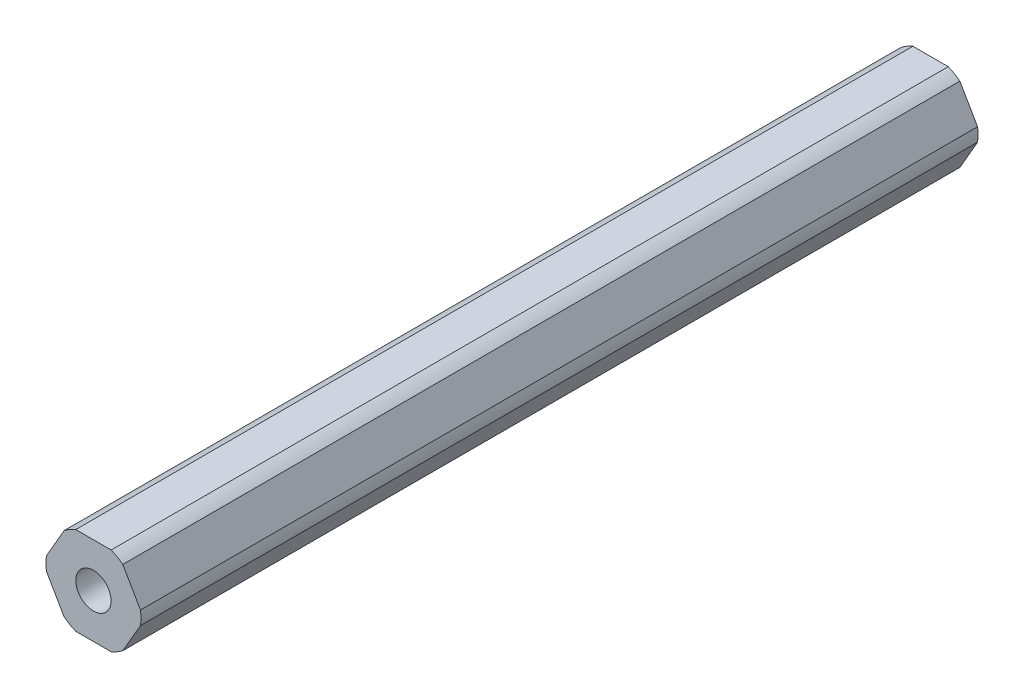
ISO-10303-21;
HEADER;
FILE_DESCRIPTION(('STEP AP214'),'2;1');
FILE_NAME('part.step','',(''),(''),'','','');
FILE_SCHEMA(('AUTOMOTIVE_DESIGN { 1 0 10303 214 1 1 1 1 }'));
ENDSEC;
DATA;
#1=APPLICATION_CONTEXT('core data for automotive mechanical design processes');
#2=APPLICATION_PROTOCOL_DEFINITION('international standard','automotive_design',2000,#1);
#3=PRODUCT_CONTEXT('',#1,'mechanical');
#4=PRODUCT('Part','Part','',(#3));
#5=PRODUCT_RELATED_PRODUCT_CATEGORY('part','',(#4));
#6=PRODUCT_DEFINITION_FORMATION('','',#4);
#7=PRODUCT_DEFINITION_CONTEXT('part definition',#1,'design');
#8=PRODUCT_DEFINITION('design','',#6,#7);
#9=PRODUCT_DEFINITION_SHAPE('','',#8);
#10=(LENGTH_UNIT() NAMED_UNIT(*) SI_UNIT(.MILLI.,.METRE.));
#11=(NAMED_UNIT(*) PLANE_ANGLE_UNIT() SI_UNIT($,.RADIAN.));
#12=(NAMED_UNIT(*) SI_UNIT($,.STERADIAN.) SOLID_ANGLE_UNIT());
#13=UNCERTAINTY_MEASURE_WITH_UNIT(LENGTH_MEASURE(1.E-05),#10,'distance_accuracy_value','');
#14=(GEOMETRIC_REPRESENTATION_CONTEXT(3) GLOBAL_UNCERTAINTY_ASSIGNED_CONTEXT((#13)) GLOBAL_UNIT_ASSIGNED_CONTEXT((#10,
#11,#12)) REPRESENTATION_CONTEXT('',''));
#15=CARTESIAN_POINT('',(0.,0.,0.));
#16=DIRECTION('',(0.,0.,1.));
#17=DIRECTION('',(1.,0.,0.));
#18=AXIS2_PLACEMENT_3D('',#15,#16,#17);
#19=CARTESIAN_POINT('',(0.,0.,-228.6));
#20=DIRECTION('',(0.,0.,1.));
#21=DIRECTION('',(1.,0.,0.));
#22=AXIS2_PLACEMENT_3D('',#19,#20,#21);
#23=CYLINDRICAL_SURFACE('',#22,6.87);
#24=DIRECTION('',(0.,0.,1.));
#25=VECTOR('',#24,1.);
#26=CARTESIAN_POINT('',(6.80102150534208,0.971085209378949,228.6));
#27=LINE('',#26,#25);
#28=CARTESIAN_POINT('',(6.80102150534208,0.97108520937895,107.52455));
#29=VERTEX_POINT('',#28);
#30=CARTESIAN_POINT('',(6.80102150534208,0.971085209378947,228.6));
#31=VERTEX_POINT('',#30);
#32=EDGE_CURVE('E109',#29,#31,#27,.T.);
#33=ORIENTED_EDGE('',*,*,#32,.T.);
#34=CARTESIAN_POINT('',(0.,0.,228.6));
#35=DIRECTION('',(0.,0.,1.));
#36=DIRECTION('',(1.,0.,0.));
#37=AXIS2_PLACEMENT_3D('',#34,#35,#36);
#38=CIRCLE('',#37,6.87);
#39=CARTESIAN_POINT('',(6.80102150534208,-0.971085209378953,228.6));
#40=VERTEX_POINT('',#39);
#41=EDGE_CURVE('E104',#31,#40,#38,.F.);
#42=ORIENTED_EDGE('',*,*,#41,.T.);
#43=DIRECTION('',(0.,0.,1.));
#44=VECTOR('',#43,1.);
#45=CARTESIAN_POINT('',(6.80102150534208,-0.971085209378954,228.6));
#46=LINE('',#45,#44);
#47=CARTESIAN_POINT('',(6.80102150534208,-0.971085209378956,107.52455));
#48=VERTEX_POINT('',#47);
#49=EDGE_CURVE('E106',#40,#48,#46,.F.);
#50=ORIENTED_EDGE('',*,*,#49,.T.);
#51=CARTESIAN_POINT('',(0.,0.,107.52455));
#52=DIRECTION('',(0.,0.,1.));
#53=DIRECTION('',(1.,0.,0.));
#54=AXIS2_PLACEMENT_3D('',#51,#52,#53);
#55=CIRCLE('',#54,6.87);
#56=EDGE_CURVE('E20',#48,#29,#55,.T.);
#57=ORIENTED_EDGE('',*,*,#56,.T.);
#58=EDGE_LOOP('',(#33,#42,#50,#57));
#59=FACE_BOUND('',#58,.T.);
#60=ADVANCED_FACE('F17',(#59),#23,.T.);
#61=CARTESIAN_POINT('',(-3.68083890619154,6.3754,228.6));
#62=DIRECTION('',(0.866025403784439,-0.5,0.));
#63=DIRECTION('',(0.5,0.866025403784439,0.));
#64=AXIS2_PLACEMENT_3D('',#61,#62,#63);
#65=PLANE('',#64);
#66=DIRECTION('',(-0.5,-0.866025403784439,0.));
#67=VECTOR('',#66,1.);
#68=CARTESIAN_POINT('',(-4.24149521323255,5.40431479062104,107.52455));
#69=LINE('',#68,#67);
#70=CARTESIAN_POINT('',(-4.24149521323255,5.40431479062105,107.52455));
#71=VERTEX_POINT('',#70);
#72=CARTESIAN_POINT('',(-6.80102150534208,0.971085209378961,107.52455));
#73=VERTEX_POINT('',#72);
#74=EDGE_CURVE('E173',#71,#73,#69,.T.);
#75=ORIENTED_EDGE('',*,*,#74,.T.);
#76=DIRECTION('',(0.,0.,1.));
#77=VECTOR('',#76,1.);
#78=CARTESIAN_POINT('',(-6.80102150534208,0.971085209378962,-228.6));
#79=LINE('',#78,#77);
#80=CARTESIAN_POINT('',(-6.80102150534208,0.971085209378964,228.6));
#81=VERTEX_POINT('',#80);
#82=EDGE_CURVE('E113',#81,#73,#79,.F.);
#83=ORIENTED_EDGE('',*,*,#82,.F.);
#84=DIRECTION('',(-0.5,-0.866025403784439,0.));
#85=VECTOR('',#84,1.);
#86=CARTESIAN_POINT('',(-4.24149521323255,5.40431479062105,228.6));
#87=LINE('',#86,#85);
#88=CARTESIAN_POINT('',(-4.24149521323255,5.40431479062104,228.6));
#89=VERTEX_POINT('',#88);
#90=EDGE_CURVE('E181',#89,#81,#87,.T.);
#91=ORIENTED_EDGE('',*,*,#90,.F.);
#92=DIRECTION('',(0.,0.,1.));
#93=VECTOR('',#92,1.);
#94=CARTESIAN_POINT('',(-4.24149521323255,5.40431479062104,-228.6));
#95=LINE('',#94,#93);
#96=EDGE_CURVE('E131',#71,#89,#95,.T.);
#97=ORIENTED_EDGE('',*,*,#96,.F.);
#98=EDGE_LOOP('',(#75,#83,#91,#97));
#99=FACE_BOUND('',#98,.T.);
#100=ADVANCED_FACE('F239',(#99),#65,.F.);
#101=CARTESIAN_POINT('',(0.,0.,-228.6));
#102=DIRECTION('',(0.,0.,1.));
#103=DIRECTION('',(1.,0.,0.));
#104=AXIS2_PLACEMENT_3D('',#101,#102,#103);
#105=CYLINDRICAL_SURFACE('',#104,6.87);
#106=CARTESIAN_POINT('',(0.,0.,228.6));
#107=DIRECTION('',(0.,0.,1.));
#108=DIRECTION('',(1.,0.,0.));
#109=AXIS2_PLACEMENT_3D('',#106,#107,#108);
#110=CIRCLE('',#109,6.87);
#111=CARTESIAN_POINT('',(-6.80102150534208,-0.971085209378954,228.6));
#112=VERTEX_POINT('',#111);
#113=EDGE_CURVE('E179',#81,#112,#110,.T.);
#114=ORIENTED_EDGE('',*,*,#113,.F.);
#115=ORIENTED_EDGE('',*,*,#82,.T.);
#116=CARTESIAN_POINT('',(0.,0.,107.52455));
#117=DIRECTION('',(0.,0.,1.));
#118=DIRECTION('',(1.,0.,0.));
#119=AXIS2_PLACEMENT_3D('',#116,#117,#118);
#120=CIRCLE('',#119,6.87);
#121=CARTESIAN_POINT('',(-6.80102150534208,-0.971085209378953,107.52455));
#122=VERTEX_POINT('',#121);
#123=EDGE_CURVE('E170',#73,#122,#120,.T.);
#124=ORIENTED_EDGE('',*,*,#123,.T.);
#125=DIRECTION('',(0.,0.,1.));
#126=VECTOR('',#125,1.);
#127=CARTESIAN_POINT('',(-6.80102150534208,-0.971085209378955,228.6));
#128=LINE('',#127,#126);
#129=EDGE_CURVE('E149',#122,#112,#128,.T.);
#130=ORIENTED_EDGE('',*,*,#129,.T.);
#131=EDGE_LOOP('',(#114,#115,#124,#130));
#132=FACE_BOUND('',#131,.T.);
#133=ADVANCED_FACE('F235',(#132),#105,.T.);
#134=CARTESIAN_POINT('',(-7.36167781238308,0.,228.6));
#135=DIRECTION('',(0.866025403784439,0.5,0.));
#136=DIRECTION('',(-0.5,0.866025403784439,0.));
#137=AXIS2_PLACEMENT_3D('',#134,#135,#136);
#138=PLANE('',#137);
#139=DIRECTION('',(0.5,-0.866025403784439,0.));
#140=VECTOR('',#139,1.);
#141=CARTESIAN_POINT('',(-6.80102150534208,-0.971085209378955,107.52455));
#142=LINE('',#141,#140);
#143=CARTESIAN_POINT('',(-4.24149521323255,-5.40431479062105,107.52455));
#144=VERTEX_POINT('',#143);
#145=EDGE_CURVE('E169',#122,#144,#142,.T.);
#146=ORIENTED_EDGE('',*,*,#145,.T.);
#147=DIRECTION('',(0.,0.,1.));
#148=VECTOR('',#147,1.);
#149=CARTESIAN_POINT('',(-4.24149521323255,-5.40431479062105,-228.6));
#150=LINE('',#149,#148);
#151=CARTESIAN_POINT('',(-4.24149521323255,-5.40431479062105,228.6));
#152=VERTEX_POINT('',#151);
#153=EDGE_CURVE('E147',#152,#144,#150,.F.);
#154=ORIENTED_EDGE('',*,*,#153,.F.);
#155=DIRECTION('',(0.5,-0.866025403784439,0.));
#156=VECTOR('',#155,1.);
#157=CARTESIAN_POINT('',(-6.80102150534208,-0.971085209378955,228.6));
#158=LINE('',#157,#156);
#159=EDGE_CURVE('E178',#112,#152,#158,.T.);
#160=ORIENTED_EDGE('',*,*,#159,.F.);
#161=ORIENTED_EDGE('',*,*,#129,.F.);
#162=EDGE_LOOP('',(#146,#154,#160,#161));
#163=FACE_BOUND('',#162,.T.);
#164=ADVANCED_FACE('F231',(#163),#138,.F.);
#165=CARTESIAN_POINT('',(0.,0.,-228.6));
#166=DIRECTION('',(0.,0.,1.));
#167=DIRECTION('',(1.,0.,0.));
#168=AXIS2_PLACEMENT_3D('',#165,#166,#167);
#169=CYLINDRICAL_SURFACE('',#168,6.87);
#170=CARTESIAN_POINT('',(0.,0.,228.6));
#171=DIRECTION('',(0.,0.,1.));
#172=DIRECTION('',(1.,0.,0.));
#173=AXIS2_PLACEMENT_3D('',#170,#171,#172);
#174=CIRCLE('',#173,6.87);
#175=CARTESIAN_POINT('',(-2.55952629210953,-6.3754,228.6));
#176=VERTEX_POINT('',#175);
#177=EDGE_CURVE('E176',#152,#176,#174,.T.);
#178=ORIENTED_EDGE('',*,*,#177,.F.);
#179=ORIENTED_EDGE('',*,*,#153,.T.);
#180=CARTESIAN_POINT('',(0.,0.,107.52455));
#181=DIRECTION('',(0.,0.,1.));
#182=DIRECTION('',(1.,0.,0.));
#183=AXIS2_PLACEMENT_3D('',#180,#181,#182);
#184=CIRCLE('',#183,6.87);
#185=CARTESIAN_POINT('',(-2.55952629210953,-6.3754,107.52455));
#186=VERTEX_POINT('',#185);
#187=EDGE_CURVE('E166',#144,#186,#184,.T.);
#188=ORIENTED_EDGE('',*,*,#187,.T.);
#189=DIRECTION('',(0.,0.,1.));
#190=VECTOR('',#189,1.);
#191=CARTESIAN_POINT('',(-2.55952629210953,-6.3754,228.6));
#192=LINE('',#191,#190);
#193=EDGE_CURVE('E144',#186,#176,#192,.T.);
#194=ORIENTED_EDGE('',*,*,#193,.T.);
#195=EDGE_LOOP('',(#178,#179,#188,#194));
#196=FACE_BOUND('',#195,.T.);
#197=ADVANCED_FACE('F227',(#196),#169,.T.);
#198=CARTESIAN_POINT('',(-3.68083890619154,-6.3754,228.6));
#199=DIRECTION('',(0.,1.,0.));
#200=DIRECTION('',(0.,0.,1.));
#201=AXIS2_PLACEMENT_3D('',#198,#199,#200);
#202=PLANE('',#201);
#203=DIRECTION('',(1.,0.,0.));
#204=VECTOR('',#203,1.);
#205=CARTESIAN_POINT('',(-17.1397032421943,-6.37540000000001,107.52455));
#206=LINE('',#205,#204);
#207=CARTESIAN_POINT('',(2.55952629210953,-6.37540000000001,107.52455));
#208=VERTEX_POINT('',#207);
#209=EDGE_CURVE('E165',#186,#208,#206,.T.);
#210=ORIENTED_EDGE('',*,*,#209,.T.);
#211=DIRECTION('',(0.,0.,1.));
#212=VECTOR('',#211,1.);
#213=CARTESIAN_POINT('',(2.55952629210953,-6.3754,-228.6));
#214=LINE('',#213,#212);
#215=CARTESIAN_POINT('',(2.55952629210953,-6.3754,228.6));
#216=VERTEX_POINT('',#215);
#217=EDGE_CURVE('E121',#216,#208,#214,.F.);
#218=ORIENTED_EDGE('',*,*,#217,.F.);
#219=DIRECTION('',(1.,0.,0.));
#220=VECTOR('',#219,1.);
#221=CARTESIAN_POINT('',(0.,-6.3754,228.6));
#222=LINE('',#221,#220);
#223=EDGE_CURVE('E175',#176,#216,#222,.T.);
#224=ORIENTED_EDGE('',*,*,#223,.F.);
#225=ORIENTED_EDGE('',*,*,#193,.F.);
#226=EDGE_LOOP('',(#210,#218,#224,#225));
#227=FACE_BOUND('',#226,.T.);
#228=ADVANCED_FACE('F222',(#227),#202,.F.);
#229=CARTESIAN_POINT('',(0.,0.,-228.6));
#230=DIRECTION('',(0.,0.,1.));
#231=DIRECTION('',(1.,0.,0.));
#232=AXIS2_PLACEMENT_3D('',#229,#230,#231);
#233=CYLINDRICAL_SURFACE('',#232,6.87);
#234=CARTESIAN_POINT('',(0.,0.,228.6));
#235=DIRECTION('',(0.,0.,1.));
#236=DIRECTION('',(1.,0.,0.));
#237=AXIS2_PLACEMENT_3D('',#234,#235,#236);
#238=CIRCLE('',#237,6.87);
#239=CARTESIAN_POINT('',(4.24149521323254,-5.40431479062105,228.6));
#240=VERTEX_POINT('',#239);
#241=EDGE_CURVE('E126',#216,#240,#238,.T.);
#242=ORIENTED_EDGE('',*,*,#241,.F.);
#243=ORIENTED_EDGE('',*,*,#217,.T.);
#244=CARTESIAN_POINT('',(0.,0.,107.52455));
#245=DIRECTION('',(0.,0.,1.));
#246=DIRECTION('',(1.,0.,0.));
#247=AXIS2_PLACEMENT_3D('',#244,#245,#246);
#248=CIRCLE('',#247,6.87);
#249=CARTESIAN_POINT('',(4.24149521323254,-5.40431479062105,107.52455));
#250=VERTEX_POINT('',#249);
#251=EDGE_CURVE('E162',#208,#250,#248,.T.);
#252=ORIENTED_EDGE('',*,*,#251,.T.);
#253=DIRECTION('',(0.,0.,1.));
#254=VECTOR('',#253,1.);
#255=CARTESIAN_POINT('',(4.24149521323254,-5.40431479062105,228.6));
#256=LINE('',#255,#254);
#257=EDGE_CURVE('E120',#250,#240,#256,.T.);
#258=ORIENTED_EDGE('',*,*,#257,.T.);
#259=EDGE_LOOP('',(#242,#243,#252,#258));
#260=FACE_BOUND('',#259,.T.);
#261=ADVANCED_FACE('F218',(#260),#233,.T.);
#262=CARTESIAN_POINT('',(3.68083890619154,-6.3754,228.6));
#263=DIRECTION('',(-0.866025403784439,0.5,0.));
#264=DIRECTION('',(-0.5,-0.866025403784439,0.));
#265=AXIS2_PLACEMENT_3D('',#262,#263,#264);
#266=PLANE('',#265);
#267=DIRECTION('',(0.5,0.866025403784439,0.));
#268=VECTOR('',#267,1.);
#269=CARTESIAN_POINT('',(4.24149521323254,-5.40431479062105,107.52455));
#270=LINE('',#269,#268);
#271=EDGE_CURVE('E119',#250,#48,#270,.T.);
#272=ORIENTED_EDGE('',*,*,#271,.T.);
#273=ORIENTED_EDGE('',*,*,#49,.F.);
#274=DIRECTION('',(0.5,0.866025403784439,0.));
#275=VECTOR('',#274,1.);
#276=CARTESIAN_POINT('',(4.24149521323254,-5.40431479062105,228.6));
#277=LINE('',#276,#275);
#278=EDGE_CURVE('E117',#240,#40,#277,.T.);
#279=ORIENTED_EDGE('',*,*,#278,.F.);
#280=ORIENTED_EDGE('',*,*,#257,.F.);
#281=EDGE_LOOP('',(#272,#273,#279,#280));
#282=FACE_BOUND('',#281,.T.);
#283=ADVANCED_FACE('F116',(#282),#266,.F.);
#284=CARTESIAN_POINT('',(7.36167781238308,0.,228.6));
#285=DIRECTION('',(-0.866025403784439,-0.5,0.));
#286=DIRECTION('',(0.5,-0.866025403784439,0.));
#287=AXIS2_PLACEMENT_3D('',#284,#285,#286);
#288=PLANE('',#287);
#289=DIRECTION('',(-0.5,0.866025403784438,0.));
#290=VECTOR('',#289,1.);
#291=CARTESIAN_POINT('',(6.80102150534208,0.971085209378948,107.52455));
#292=LINE('',#291,#290);
#293=CARTESIAN_POINT('',(4.24149521323254,5.40431479062105,107.52455));
#294=VERTEX_POINT('',#293);
#295=EDGE_CURVE('E161',#29,#294,#292,.T.);
#296=ORIENTED_EDGE('',*,*,#295,.T.);
#297=DIRECTION('',(0.,0.,1.));
#298=VECTOR('',#297,1.);
#299=CARTESIAN_POINT('',(4.24149521323254,5.40431479062105,-228.6));
#300=LINE('',#299,#298);
#301=CARTESIAN_POINT('',(4.24149521323254,5.40431479062105,228.6));
#302=VERTEX_POINT('',#301);
#303=EDGE_CURVE('E139',#302,#294,#300,.F.);
#304=ORIENTED_EDGE('',*,*,#303,.F.);
#305=DIRECTION('',(-0.5,0.866025403784439,0.));
#306=VECTOR('',#305,1.);
#307=CARTESIAN_POINT('',(6.80102150534208,0.971085209378948,228.6));
#308=LINE('',#307,#306);
#309=EDGE_CURVE('E127',#31,#302,#308,.T.);
#310=ORIENTED_EDGE('',*,*,#309,.F.);
#311=ORIENTED_EDGE('',*,*,#32,.F.);
#312=EDGE_LOOP('',(#296,#304,#310,#311));
#313=FACE_BOUND('',#312,.T.);
#314=ADVANCED_FACE('F213',(#313),#288,.F.);
#315=CARTESIAN_POINT('',(0.,0.,-228.6));
#316=DIRECTION('',(0.,0.,1.));
#317=DIRECTION('',(1.,0.,0.));
#318=AXIS2_PLACEMENT_3D('',#315,#316,#317);
#319=CYLINDRICAL_SURFACE('',#318,6.87);
#320=CARTESIAN_POINT('',(0.,0.,228.6));
#321=DIRECTION('',(0.,0.,1.));
#322=DIRECTION('',(1.,0.,0.));
#323=AXIS2_PLACEMENT_3D('',#320,#321,#322);
#324=CIRCLE('',#323,6.87);
#325=CARTESIAN_POINT('',(2.55952629210953,6.37540000000001,228.6));
#326=VERTEX_POINT('',#325);
#327=EDGE_CURVE('E129',#302,#326,#324,.T.);
#328=ORIENTED_EDGE('',*,*,#327,.F.);
#329=ORIENTED_EDGE('',*,*,#303,.T.);
#330=CARTESIAN_POINT('',(0.,0.,107.52455));
#331=DIRECTION('',(0.,0.,1.));
#332=DIRECTION('',(1.,0.,0.));
#333=AXIS2_PLACEMENT_3D('',#330,#331,#332);
#334=CIRCLE('',#333,6.87);
#335=CARTESIAN_POINT('',(2.55952629210953,6.37540000000001,107.52455));
#336=VERTEX_POINT('',#335);
#337=EDGE_CURVE('E158',#294,#336,#334,.T.);
#338=ORIENTED_EDGE('',*,*,#337,.T.);
#339=DIRECTION('',(0.,0.,1.));
#340=VECTOR('',#339,1.);
#341=CARTESIAN_POINT('',(2.55952629210953,6.3754,228.6));
#342=LINE('',#341,#340);
#343=EDGE_CURVE('E136',#336,#326,#342,.T.);
#344=ORIENTED_EDGE('',*,*,#343,.T.);
#345=EDGE_LOOP('',(#328,#329,#338,#344));
#346=FACE_BOUND('',#345,.T.);
#347=ADVANCED_FACE('F210',(#346),#319,.T.);
#348=CARTESIAN_POINT('',(3.68083890619154,6.3754,228.6));
#349=DIRECTION('',(0.,-1.,0.));
#350=DIRECTION('',(1.,0.,0.));
#351=AXIS2_PLACEMENT_3D('',#348,#349,#350);
#352=PLANE('',#351);
#353=DIRECTION('',(1.,0.,0.));
#354=VECTOR('',#353,1.);
#355=CARTESIAN_POINT('',(-17.1397032421943,6.37540000000001,107.52455));
#356=LINE('',#355,#354);
#357=CARTESIAN_POINT('',(-2.55952629210953,6.37540000000001,107.52455));
#358=VERTEX_POINT('',#357);
#359=EDGE_CURVE('E157',#336,#358,#356,.F.);
#360=ORIENTED_EDGE('',*,*,#359,.T.);
#361=DIRECTION('',(0.,0.,1.));
#362=VECTOR('',#361,1.);
#363=CARTESIAN_POINT('',(-2.55952629210953,6.37540000000001,-228.6));
#364=LINE('',#363,#362);
#365=CARTESIAN_POINT('',(-2.55952629210953,6.37540000000001,228.6));
#366=VERTEX_POINT('',#365);
#367=EDGE_CURVE('E35',#366,#358,#364,.F.);
#368=ORIENTED_EDGE('',*,*,#367,.F.);
#369=DIRECTION('',(1.,0.,0.));
#370=VECTOR('',#369,1.);
#371=CARTESIAN_POINT('',(0.,6.37540000000001,228.6));
#372=LINE('',#371,#370);
#373=EDGE_CURVE('E185',#326,#366,#372,.F.);
#374=ORIENTED_EDGE('',*,*,#373,.F.);
#375=ORIENTED_EDGE('',*,*,#343,.F.);
#376=EDGE_LOOP('',(#360,#368,#374,#375));
#377=FACE_BOUND('',#376,.T.);
#378=ADVANCED_FACE('F204',(#377),#352,.F.);
#379=CARTESIAN_POINT('',(0.,0.,-228.6));
#380=DIRECTION('',(0.,0.,1.));
#381=DIRECTION('',(1.,0.,0.));
#382=AXIS2_PLACEMENT_3D('',#379,#380,#381);
#383=CYLINDRICAL_SURFACE('',#382,6.87);
#384=CARTESIAN_POINT('',(0.,0.,228.6));
#385=DIRECTION('',(0.,0.,1.));
#386=DIRECTION('',(1.,0.,0.));
#387=AXIS2_PLACEMENT_3D('',#384,#385,#386);
#388=CIRCLE('',#387,6.87);
#389=EDGE_CURVE('E182',#366,#89,#388,.T.);
#390=ORIENTED_EDGE('',*,*,#389,.F.);
#391=ORIENTED_EDGE('',*,*,#367,.T.);
#392=CARTESIAN_POINT('',(0.,0.,107.52455));
#393=DIRECTION('',(0.,0.,1.));
#394=DIRECTION('',(1.,0.,0.));
#395=AXIS2_PLACEMENT_3D('',#392,#393,#394);
#396=CIRCLE('',#395,6.87);
#397=EDGE_CURVE('E155',#358,#71,#396,.T.);
#398=ORIENTED_EDGE('',*,*,#397,.T.);
#399=ORIENTED_EDGE('',*,*,#96,.T.);
#400=EDGE_LOOP('',(#390,#391,#398,#399));
#401=FACE_BOUND('',#400,.T.);
#402=ADVANCED_FACE('F241',(#401),#383,.T.);
#403=CARTESIAN_POINT('',(0.,0.,228.6));
#404=DIRECTION('',(0.,0.,1.));
#405=DIRECTION('',(1.,0.,0.));
#406=AXIS2_PLACEMENT_3D('',#403,#404,#405);
#407=PLANE('',#406);
#408=CARTESIAN_POINT('',(0.,0.,228.6));
#409=DIRECTION('',(0.,0.,1.));
#410=DIRECTION('',(1.,0.,0.));
#411=AXIS2_PLACEMENT_3D('',#408,#409,#410);
#412=CIRCLE('',#411,2.55);
#413=CARTESIAN_POINT('',(2.55,0.,228.6));
#414=VERTEX_POINT('',#413);
#415=EDGE_CURVE('E26',#414,#414,#412,.F.);
#416=ORIENTED_EDGE('',*,*,#415,.T.);
#417=EDGE_LOOP('',(#416));
#418=FACE_BOUND('',#417,.T.);
#419=ORIENTED_EDGE('',*,*,#223,.T.);
#420=ORIENTED_EDGE('',*,*,#241,.T.);
#421=ORIENTED_EDGE('',*,*,#278,.T.);
#422=ORIENTED_EDGE('',*,*,#41,.F.);
#423=ORIENTED_EDGE('',*,*,#309,.T.);
#424=ORIENTED_EDGE('',*,*,#327,.T.);
#425=ORIENTED_EDGE('',*,*,#373,.T.);
#426=ORIENTED_EDGE('',*,*,#389,.T.);
#427=ORIENTED_EDGE('',*,*,#90,.T.);
#428=ORIENTED_EDGE('',*,*,#113,.T.);
#429=ORIENTED_EDGE('',*,*,#159,.T.);
#430=ORIENTED_EDGE('',*,*,#177,.T.);
#431=EDGE_LOOP('',(#419,#420,#421,#422,#423,#424,#425,#426,#427,#428,#429,#430));
#432=FACE_BOUND('',#431,.T.);
#433=ADVANCED_FACE('F124',(#418,#432),#407,.T.);
#434=CARTESIAN_POINT('',(-17.1397032421943,-6.37540000000001,107.52455));
#435=DIRECTION('',(0.,0.,1.));
#436=DIRECTION('',(1.,0.,0.));
#437=AXIS2_PLACEMENT_3D('',#434,#435,#436);
#438=PLANE('',#437);
#439=CARTESIAN_POINT('',(0.,0.,107.52455));
#440=DIRECTION('',(0.,0.,1.));
#441=DIRECTION('',(1.,0.,0.));
#442=AXIS2_PLACEMENT_3D('',#439,#440,#441);
#443=CIRCLE('',#442,2.55);
#444=CARTESIAN_POINT('',(2.55,0.,107.52455));
#445=VERTEX_POINT('',#444);
#446=EDGE_CURVE('E11',#445,#445,#443,.T.);
#447=ORIENTED_EDGE('',*,*,#446,.T.);
#448=EDGE_LOOP('',(#447));
#449=FACE_BOUND('',#448,.T.);
#450=ORIENTED_EDGE('',*,*,#359,.F.);
#451=ORIENTED_EDGE('',*,*,#337,.F.);
#452=ORIENTED_EDGE('',*,*,#295,.F.);
#453=ORIENTED_EDGE('',*,*,#56,.F.);
#454=ORIENTED_EDGE('',*,*,#271,.F.);
#455=ORIENTED_EDGE('',*,*,#251,.F.);
#456=ORIENTED_EDGE('',*,*,#209,.F.);
#457=ORIENTED_EDGE('',*,*,#187,.F.);
#458=ORIENTED_EDGE('',*,*,#145,.F.);
#459=ORIENTED_EDGE('',*,*,#123,.F.);
#460=ORIENTED_EDGE('',*,*,#74,.F.);
#461=ORIENTED_EDGE('',*,*,#397,.F.);
#462=EDGE_LOOP('',(#450,#451,#452,#453,#454,#455,#456,#457,#458,#459,#460,#461));
#463=FACE_BOUND('',#462,.T.);
#464=ADVANCED_FACE('F207',(#449,#463),#438,.F.);
#465=CARTESIAN_POINT('',(0.,0.,-228.6));
#466=DIRECTION('',(0.,0.,1.));
#467=DIRECTION('',(1.,0.,0.));
#468=AXIS2_PLACEMENT_3D('',#465,#466,#467);
#469=CYLINDRICAL_SURFACE('',#468,2.55);
#470=ORIENTED_EDGE('',*,*,#415,.F.);
#471=EDGE_LOOP('',(#470));
#472=FACE_BOUND('',#471,.T.);
#473=ORIENTED_EDGE('',*,*,#446,.F.);
#474=EDGE_LOOP('',(#473));
#475=FACE_BOUND('',#474,.T.);
#476=ADVANCED_FACE('F252',(#472,#475),#469,.F.);
#477=CLOSED_SHELL('',(#60,#100,#133,#164,#197,#228,#261,#283,#314,#347,#378,#402,#433,#464,#476));
#478=MANIFOLD_SOLID_BREP('B1',#477);
#479=ADVANCED_BREP_SHAPE_REPRESENTATION('',(#18,#478),#14);
#480=SHAPE_DEFINITION_REPRESENTATION(#9,#479);
ENDSEC;
END-ISO-10303-21;
